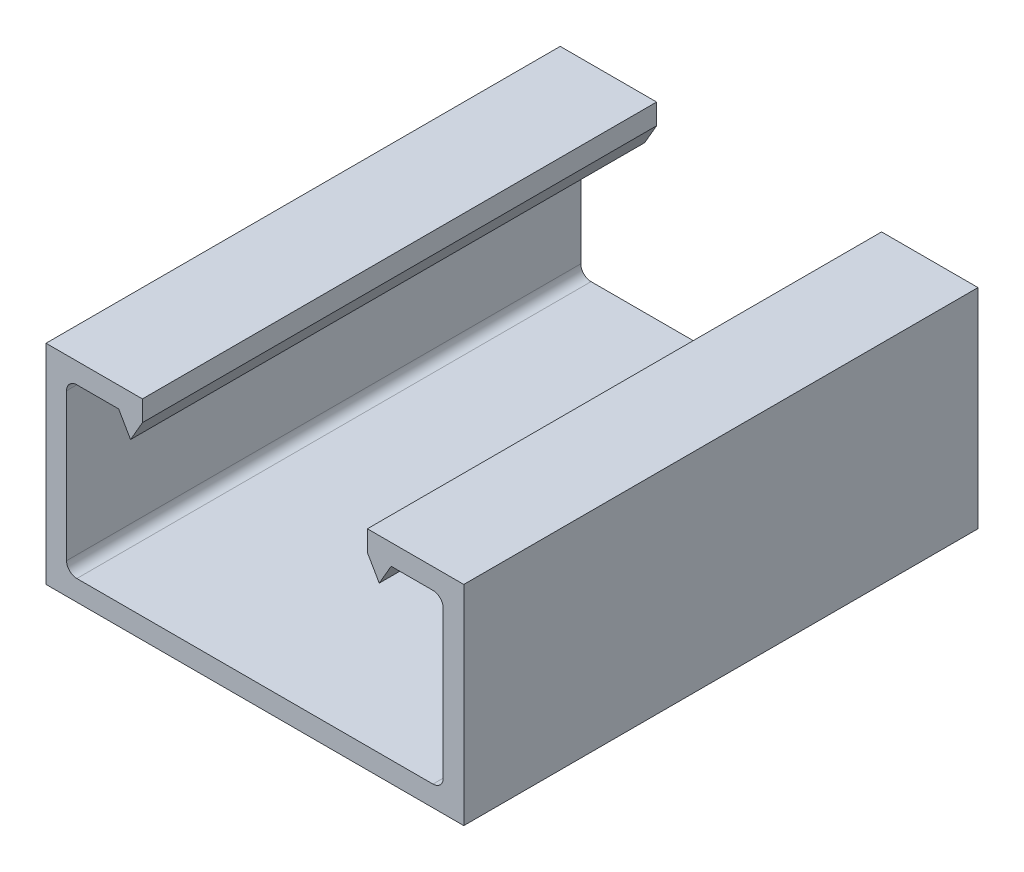
ISO-10303-21;
HEADER;
FILE_DESCRIPTION(('STEP AP214'),'2;1');
FILE_NAME('part.step','',(''),(''),'','','');
FILE_SCHEMA(('AUTOMOTIVE_DESIGN { 1 0 10303 214 1 1 1 1 }'));
ENDSEC;
DATA;
#1=APPLICATION_CONTEXT('core data for automotive mechanical design processes');
#2=APPLICATION_PROTOCOL_DEFINITION('international standard','automotive_design',2000,#1);
#3=PRODUCT_CONTEXT('',#1,'mechanical');
#4=PRODUCT('Part','Part','',(#3));
#5=PRODUCT_RELATED_PRODUCT_CATEGORY('part','',(#4));
#6=PRODUCT_DEFINITION_FORMATION('','',#4);
#7=PRODUCT_DEFINITION_CONTEXT('part definition',#1,'design');
#8=PRODUCT_DEFINITION('design','',#6,#7);
#9=PRODUCT_DEFINITION_SHAPE('','',#8);
#10=(LENGTH_UNIT() NAMED_UNIT(*) SI_UNIT(.MILLI.,.METRE.));
#11=(NAMED_UNIT(*) PLANE_ANGLE_UNIT() SI_UNIT($,.RADIAN.));
#12=(NAMED_UNIT(*) SI_UNIT($,.STERADIAN.) SOLID_ANGLE_UNIT());
#13=UNCERTAINTY_MEASURE_WITH_UNIT(LENGTH_MEASURE(1.E-05),#10,'distance_accuracy_value','');
#14=(GEOMETRIC_REPRESENTATION_CONTEXT(3) GLOBAL_UNCERTAINTY_ASSIGNED_CONTEXT((#13)) GLOBAL_UNIT_ASSIGNED_CONTEXT((#10,
#11,#12)) REPRESENTATION_CONTEXT('',''));
#15=CARTESIAN_POINT('',(0.,0.,0.));
#16=DIRECTION('',(0.,0.,1.));
#17=DIRECTION('',(1.,0.,0.));
#18=AXIS2_PLACEMENT_3D('',#15,#16,#17);
#19=CARTESIAN_POINT('',(-8.79475,-3.635375,12.7));
#20=DIRECTION('',(0.,0.,-1.));
#21=DIRECTION('',(-1.,0.,0.));
#22=AXIS2_PLACEMENT_3D('',#19,#20,#21);
#23=CYLINDRICAL_SURFACE('',#22,0.508);
#24=CARTESIAN_POINT('',(-8.79475,-3.635375,-12.7));
#25=DIRECTION('',(0.,0.,-1.));
#26=DIRECTION('',(1.,0.,0.));
#27=AXIS2_PLACEMENT_3D('',#24,#25,#26);
#28=CIRCLE('',#27,0.508);
#29=CARTESIAN_POINT('',(-8.79475,-4.143375,-12.7));
#30=VERTEX_POINT('',#29);
#31=CARTESIAN_POINT('',(-9.30275,-3.635375,-12.7));
#32=VERTEX_POINT('',#31);
#33=EDGE_CURVE('E200',#30,#32,#28,.T.);
#34=ORIENTED_EDGE('',*,*,#33,.T.);
#35=DIRECTION('',(0.,0.,-1.));
#36=VECTOR('',#35,1.);
#37=CARTESIAN_POINT('',(-9.30275,-3.635375,12.7));
#38=LINE('',#37,#36);
#39=CARTESIAN_POINT('',(-9.30275,-3.635375,12.7));
#40=VERTEX_POINT('',#39);
#41=EDGE_CURVE('E11',#40,#32,#38,.T.);
#42=ORIENTED_EDGE('',*,*,#41,.F.);
#43=CARTESIAN_POINT('',(-8.79475,-3.635375,12.7));
#44=DIRECTION('',(0.,0.,-1.));
#45=DIRECTION('',(1.,0.,0.));
#46=AXIS2_PLACEMENT_3D('',#43,#44,#45);
#47=CIRCLE('',#46,0.508);
#48=CARTESIAN_POINT('',(-8.79475,-4.143375,12.7));
#49=VERTEX_POINT('',#48);
#50=EDGE_CURVE('E238',#49,#40,#47,.T.);
#51=ORIENTED_EDGE('',*,*,#50,.F.);
#52=DIRECTION('',(0.,0.,-1.));
#53=VECTOR('',#52,1.);
#54=CARTESIAN_POINT('',(-8.79475,-4.143375,12.7));
#55=LINE('',#54,#53);
#56=EDGE_CURVE('E196',#49,#30,#55,.T.);
#57=ORIENTED_EDGE('',*,*,#56,.T.);
#58=EDGE_LOOP('',(#34,#42,#51,#57));
#59=FACE_BOUND('',#58,.T.);
#60=ADVANCED_FACE('F32',(#59),#23,.F.);
#61=CARTESIAN_POINT('',(-9.30275,3.635375,12.7));
#62=DIRECTION('',(-1.,0.,0.));
#63=DIRECTION('',(0.,-1.,0.));
#64=AXIS2_PLACEMENT_3D('',#61,#62,#63);
#65=PLANE('',#64);
#66=DIRECTION('',(0.,1.,0.));
#67=VECTOR('',#66,1.);
#68=CARTESIAN_POINT('',(-9.30275,3.635375,-12.7));
#69=LINE('',#68,#67);
#70=CARTESIAN_POINT('',(-9.30275,3.635375,-12.7));
#71=VERTEX_POINT('',#70);
#72=EDGE_CURVE('E203',#32,#71,#69,.T.);
#73=ORIENTED_EDGE('',*,*,#72,.T.);
#74=DIRECTION('',(0.,0.,-1.));
#75=VECTOR('',#74,1.);
#76=CARTESIAN_POINT('',(-9.30275,3.635375,12.7));
#77=LINE('',#76,#75);
#78=CARTESIAN_POINT('',(-9.30275,3.635375,12.7));
#79=VERTEX_POINT('',#78);
#80=EDGE_CURVE('E40',#79,#71,#77,.T.);
#81=ORIENTED_EDGE('',*,*,#80,.F.);
#82=DIRECTION('',(0.,1.,0.));
#83=VECTOR('',#82,1.);
#84=CARTESIAN_POINT('',(-9.30275,3.635375,12.7));
#85=LINE('',#84,#83);
#86=EDGE_CURVE('E127',#40,#79,#85,.T.);
#87=ORIENTED_EDGE('',*,*,#86,.F.);
#88=ORIENTED_EDGE('',*,*,#41,.T.);
#89=EDGE_LOOP('',(#73,#81,#87,#88));
#90=FACE_BOUND('',#89,.T.);
#91=ADVANCED_FACE('F356',(#90),#65,.F.);
#92=CARTESIAN_POINT('',(-8.79475,3.635375,12.7));
#93=DIRECTION('',(0.,0.,-1.));
#94=DIRECTION('',(-1.,0.,0.));
#95=AXIS2_PLACEMENT_3D('',#92,#93,#94);
#96=CYLINDRICAL_SURFACE('',#95,0.508000000000002);
#97=CARTESIAN_POINT('',(-8.79475,3.635375,-12.7));
#98=DIRECTION('',(0.,0.,-1.));
#99=DIRECTION('',(1.,0.,0.));
#100=AXIS2_PLACEMENT_3D('',#97,#98,#99);
#101=CIRCLE('',#100,0.508000000000002);
#102=CARTESIAN_POINT('',(-8.79475,4.143375,-12.7));
#103=VERTEX_POINT('',#102);
#104=EDGE_CURVE('E205',#71,#103,#101,.T.);
#105=ORIENTED_EDGE('',*,*,#104,.T.);
#106=DIRECTION('',(0.,0.,-1.));
#107=VECTOR('',#106,1.);
#108=CARTESIAN_POINT('',(-8.79475,4.143375,12.7));
#109=LINE('',#108,#107);
#110=CARTESIAN_POINT('',(-8.79475,4.143375,12.7));
#111=VERTEX_POINT('',#110);
#112=EDGE_CURVE('E281',#111,#103,#109,.T.);
#113=ORIENTED_EDGE('',*,*,#112,.F.);
#114=CARTESIAN_POINT('',(-8.79475,3.635375,12.7));
#115=DIRECTION('',(0.,0.,-1.));
#116=DIRECTION('',(1.,0.,0.));
#117=AXIS2_PLACEMENT_3D('',#114,#115,#116);
#118=CIRCLE('',#117,0.508000000000002);
#119=EDGE_CURVE('E289',#79,#111,#118,.T.);
#120=ORIENTED_EDGE('',*,*,#119,.F.);
#121=ORIENTED_EDGE('',*,*,#80,.T.);
#122=EDGE_LOOP('',(#105,#113,#120,#121));
#123=FACE_BOUND('',#122,.T.);
#124=ADVANCED_FACE('F287',(#123),#96,.F.);
#125=CARTESIAN_POINT('',(-6.72942574699331,4.143375,12.7));
#126=DIRECTION('',(0.,1.,0.));
#127=DIRECTION('',(0.,0.,1.));
#128=AXIS2_PLACEMENT_3D('',#125,#126,#127);
#129=PLANE('',#128);
#130=DIRECTION('',(1.,0.,0.));
#131=VECTOR('',#130,1.);
#132=CARTESIAN_POINT('',(-6.72942574699331,4.143375,-12.7));
#133=LINE('',#132,#131);
#134=CARTESIAN_POINT('',(-6.72942574699331,4.143375,-12.7));
#135=VERTEX_POINT('',#134);
#136=EDGE_CURVE('E207',#103,#135,#133,.T.);
#137=ORIENTED_EDGE('',*,*,#136,.T.);
#138=DIRECTION('',(0.,0.,-1.));
#139=VECTOR('',#138,1.);
#140=CARTESIAN_POINT('',(-6.72942574699331,4.143375,12.7));
#141=LINE('',#140,#139);
#142=CARTESIAN_POINT('',(-6.72942574699331,4.143375,12.7));
#143=VERTEX_POINT('',#142);
#144=EDGE_CURVE('E278',#143,#135,#141,.T.);
#145=ORIENTED_EDGE('',*,*,#144,.F.);
#146=DIRECTION('',(1.,0.,0.));
#147=VECTOR('',#146,1.);
#148=CARTESIAN_POINT('',(-6.72942574699331,4.143375,12.7));
#149=LINE('',#148,#147);
#150=EDGE_CURVE('E307',#111,#143,#149,.T.);
#151=ORIENTED_EDGE('',*,*,#150,.F.);
#152=ORIENTED_EDGE('',*,*,#112,.T.);
#153=EDGE_LOOP('',(#137,#145,#151,#152));
#154=FACE_BOUND('',#153,.T.);
#155=ADVANCED_FACE('F298',(#154),#129,.F.);
#156=CARTESIAN_POINT('',(-6.72942574699331,4.143375,12.7));
#157=DIRECTION('',(0.866025404088332,0.499999999473641,0.));
#158=DIRECTION('',(-0.499999999473641,0.866025404088332,0.));
#159=AXIS2_PLACEMENT_3D('',#156,#157,#158);
#160=PLANE('',#159);
#161=DIRECTION('',(0.499999999473641,-0.866025404088332,0.));
#162=VECTOR('',#161,1.);
#163=CARTESIAN_POINT('',(-6.72942574699331,4.143375,-12.7));
#164=LINE('',#163,#162);
#165=CARTESIAN_POINT('',(-6.14283787432,3.127375,-12.7));
#166=VERTEX_POINT('',#165);
#167=EDGE_CURVE('E209',#135,#166,#164,.T.);
#168=ORIENTED_EDGE('',*,*,#167,.T.);
#169=DIRECTION('',(0.,0.,-1.));
#170=VECTOR('',#169,1.);
#171=CARTESIAN_POINT('',(-6.14283787432,3.127375,12.7));
#172=LINE('',#171,#170);
#173=CARTESIAN_POINT('',(-6.14283787432,3.127375,12.7));
#174=VERTEX_POINT('',#173);
#175=EDGE_CURVE('E275',#174,#166,#172,.T.);
#176=ORIENTED_EDGE('',*,*,#175,.F.);
#177=DIRECTION('',(0.499999999473641,-0.866025404088332,0.));
#178=VECTOR('',#177,1.);
#179=CARTESIAN_POINT('',(-6.72942574699331,4.143375,12.7));
#180=LINE('',#179,#178);
#181=EDGE_CURVE('E304',#143,#174,#180,.T.);
#182=ORIENTED_EDGE('',*,*,#181,.F.);
#183=ORIENTED_EDGE('',*,*,#144,.T.);
#184=EDGE_LOOP('',(#168,#176,#182,#183));
#185=FACE_BOUND('',#184,.T.);
#186=ADVANCED_FACE('F302',(#185),#160,.F.);
#187=CARTESIAN_POINT('',(-6.14283787432,3.127375,12.7));
#188=DIRECTION('',(-0.866025403480547,0.500000000526355,0.));
#189=DIRECTION('',(-0.500000000526355,-0.866025403480548,0.));
#190=AXIS2_PLACEMENT_3D('',#187,#188,#189);
#191=PLANE('',#190);
#192=DIRECTION('',(0.500000000526355,0.866025403480547,0.));
#193=VECTOR('',#192,1.);
#194=CARTESIAN_POINT('',(-6.14283787432,3.127375,-12.7));
#195=LINE('',#194,#193);
#196=CARTESIAN_POINT('',(-5.55625,4.143375,-12.7));
#197=VERTEX_POINT('',#196);
#198=EDGE_CURVE('E211',#166,#197,#195,.T.);
#199=ORIENTED_EDGE('',*,*,#198,.T.);
#200=DIRECTION('',(0.,0.,-1.));
#201=VECTOR('',#200,1.);
#202=CARTESIAN_POINT('',(-5.55625,4.143375,12.7));
#203=LINE('',#202,#201);
#204=CARTESIAN_POINT('',(-5.55625,4.143375,12.7));
#205=VERTEX_POINT('',#204);
#206=EDGE_CURVE('E272',#205,#197,#203,.T.);
#207=ORIENTED_EDGE('',*,*,#206,.F.);
#208=DIRECTION('',(0.500000000526355,0.866025403480547,0.));
#209=VECTOR('',#208,1.);
#210=CARTESIAN_POINT('',(-6.14283787432,3.127375,12.7));
#211=LINE('',#210,#209);
#212=EDGE_CURVE('E306',#174,#205,#211,.T.);
#213=ORIENTED_EDGE('',*,*,#212,.F.);
#214=ORIENTED_EDGE('',*,*,#175,.T.);
#215=EDGE_LOOP('',(#199,#207,#213,#214));
#216=FACE_BOUND('',#215,.T.);
#217=ADVANCED_FACE('F369',(#216),#191,.F.);
#218=CARTESIAN_POINT('',(-5.55625,4.143375,12.7));
#219=DIRECTION('',(-1.,0.,0.));
#220=DIRECTION('',(0.,0.,1.));
#221=AXIS2_PLACEMENT_3D('',#218,#219,#220);
#222=PLANE('',#221);
#223=DIRECTION('',(0.,1.,0.));
#224=VECTOR('',#223,1.);
#225=CARTESIAN_POINT('',(-5.55625,4.143375,-12.7));
#226=LINE('',#225,#224);
#227=CARTESIAN_POINT('',(-5.55625,5.159375,-12.7));
#228=VERTEX_POINT('',#227);
#229=EDGE_CURVE('E213',#197,#228,#226,.T.);
#230=ORIENTED_EDGE('',*,*,#229,.T.);
#231=DIRECTION('',(0.,0.,-1.));
#232=VECTOR('',#231,1.);
#233=CARTESIAN_POINT('',(-5.55625,5.159375,12.7));
#234=LINE('',#233,#232);
#235=CARTESIAN_POINT('',(-5.55625,5.159375,12.7));
#236=VERTEX_POINT('',#235);
#237=EDGE_CURVE('E269',#236,#228,#234,.T.);
#238=ORIENTED_EDGE('',*,*,#237,.F.);
#239=DIRECTION('',(0.,1.,0.));
#240=VECTOR('',#239,1.);
#241=CARTESIAN_POINT('',(-5.55625,4.143375,12.7));
#242=LINE('',#241,#240);
#243=EDGE_CURVE('E309',#205,#236,#242,.T.);
#244=ORIENTED_EDGE('',*,*,#243,.F.);
#245=ORIENTED_EDGE('',*,*,#206,.T.);
#246=EDGE_LOOP('',(#230,#238,#244,#245));
#247=FACE_BOUND('',#246,.T.);
#248=ADVANCED_FACE('F372',(#247),#222,.F.);
#249=CARTESIAN_POINT('',(-5.55625,5.159375,12.7));
#250=DIRECTION('',(0.,-1.,0.));
#251=DIRECTION('',(1.,0.,0.));
#252=AXIS2_PLACEMENT_3D('',#249,#250,#251);
#253=PLANE('',#252);
#254=DIRECTION('',(-1.,0.,0.));
#255=VECTOR('',#254,1.);
#256=CARTESIAN_POINT('',(-5.55625,5.159375,-12.7));
#257=LINE('',#256,#255);
#258=CARTESIAN_POINT('',(-10.31875,5.159375,-12.7));
#259=VERTEX_POINT('',#258);
#260=EDGE_CURVE('E215',#228,#259,#257,.T.);
#261=ORIENTED_EDGE('',*,*,#260,.T.);
#262=DIRECTION('',(0.,0.,-1.));
#263=VECTOR('',#262,1.);
#264=CARTESIAN_POINT('',(-10.31875,5.159375,12.7));
#265=LINE('',#264,#263);
#266=CARTESIAN_POINT('',(-10.31875,5.159375,12.7));
#267=VERTEX_POINT('',#266);
#268=EDGE_CURVE('E266',#267,#259,#265,.T.);
#269=ORIENTED_EDGE('',*,*,#268,.F.);
#270=DIRECTION('',(-1.,0.,0.));
#271=VECTOR('',#270,1.);
#272=CARTESIAN_POINT('',(-5.55625,5.159375,12.7));
#273=LINE('',#272,#271);
#274=EDGE_CURVE('E315',#236,#267,#273,.T.);
#275=ORIENTED_EDGE('',*,*,#274,.F.);
#276=ORIENTED_EDGE('',*,*,#237,.T.);
#277=EDGE_LOOP('',(#261,#269,#275,#276));
#278=FACE_BOUND('',#277,.T.);
#279=ADVANCED_FACE('F376',(#278),#253,.F.);
#280=CARTESIAN_POINT('',(-10.31875,5.159375,12.7));
#281=DIRECTION('',(1.,0.,0.));
#282=DIRECTION('',(0.,0.,-1.));
#283=AXIS2_PLACEMENT_3D('',#280,#281,#282);
#284=PLANE('',#283);
#285=DIRECTION('',(0.,-1.,0.));
#286=VECTOR('',#285,1.);
#287=CARTESIAN_POINT('',(-10.31875,5.159375,-12.7));
#288=LINE('',#287,#286);
#289=CARTESIAN_POINT('',(-10.31875,-5.159375,-12.7));
#290=VERTEX_POINT('',#289);
#291=EDGE_CURVE('E217',#259,#290,#288,.T.);
#292=ORIENTED_EDGE('',*,*,#291,.T.);
#293=DIRECTION('',(0.,0.,-1.));
#294=VECTOR('',#293,1.);
#295=CARTESIAN_POINT('',(-10.31875,-5.159375,12.7));
#296=LINE('',#295,#294);
#297=CARTESIAN_POINT('',(-10.31875,-5.159375,12.7));
#298=VERTEX_POINT('',#297);
#299=EDGE_CURVE('E263',#298,#290,#296,.T.);
#300=ORIENTED_EDGE('',*,*,#299,.F.);
#301=DIRECTION('',(0.,-1.,0.));
#302=VECTOR('',#301,1.);
#303=CARTESIAN_POINT('',(-10.31875,5.159375,12.7));
#304=LINE('',#303,#302);
#305=EDGE_CURVE('E317',#267,#298,#304,.T.);
#306=ORIENTED_EDGE('',*,*,#305,.F.);
#307=ORIENTED_EDGE('',*,*,#268,.T.);
#308=EDGE_LOOP('',(#292,#300,#306,#307));
#309=FACE_BOUND('',#308,.T.);
#310=ADVANCED_FACE('F380',(#309),#284,.F.);
#311=CARTESIAN_POINT('',(-10.31875,-5.159375,12.7));
#312=DIRECTION('',(0.,1.,0.));
#313=DIRECTION('',(0.,0.,1.));
#314=AXIS2_PLACEMENT_3D('',#311,#312,#313);
#315=PLANE('',#314);
#316=DIRECTION('',(1.,0.,0.));
#317=VECTOR('',#316,1.);
#318=CARTESIAN_POINT('',(-10.31875,-5.159375,-12.7));
#319=LINE('',#318,#317);
#320=CARTESIAN_POINT('',(10.31875,-5.159375,-12.7));
#321=VERTEX_POINT('',#320);
#322=EDGE_CURVE('E219',#290,#321,#319,.T.);
#323=ORIENTED_EDGE('',*,*,#322,.T.);
#324=DIRECTION('',(0.,0.,-1.));
#325=VECTOR('',#324,1.);
#326=CARTESIAN_POINT('',(10.31875,-5.159375,12.7));
#327=LINE('',#326,#325);
#328=CARTESIAN_POINT('',(10.31875,-5.159375,12.7));
#329=VERTEX_POINT('',#328);
#330=EDGE_CURVE('E260',#329,#321,#327,.T.);
#331=ORIENTED_EDGE('',*,*,#330,.F.);
#332=DIRECTION('',(1.,0.,0.));
#333=VECTOR('',#332,1.);
#334=CARTESIAN_POINT('',(-10.31875,-5.159375,12.7));
#335=LINE('',#334,#333);
#336=EDGE_CURVE('E319',#298,#329,#335,.T.);
#337=ORIENTED_EDGE('',*,*,#336,.F.);
#338=ORIENTED_EDGE('',*,*,#299,.T.);
#339=EDGE_LOOP('',(#323,#331,#337,#338));
#340=FACE_BOUND('',#339,.T.);
#341=ADVANCED_FACE('F384',(#340),#315,.F.);
#342=CARTESIAN_POINT('',(10.31875,-5.159375,12.7));
#343=DIRECTION('',(-1.,0.,0.));
#344=DIRECTION('',(0.,-1.,0.));
#345=AXIS2_PLACEMENT_3D('',#342,#343,#344);
#346=PLANE('',#345);
#347=DIRECTION('',(0.,1.,0.));
#348=VECTOR('',#347,1.);
#349=CARTESIAN_POINT('',(10.31875,-5.159375,-12.7));
#350=LINE('',#349,#348);
#351=CARTESIAN_POINT('',(10.31875,5.159375,-12.7));
#352=VERTEX_POINT('',#351);
#353=EDGE_CURVE('E221',#321,#352,#350,.T.);
#354=ORIENTED_EDGE('',*,*,#353,.T.);
#355=DIRECTION('',(0.,0.,-1.));
#356=VECTOR('',#355,1.);
#357=CARTESIAN_POINT('',(10.31875,5.159375,12.7));
#358=LINE('',#357,#356);
#359=CARTESIAN_POINT('',(10.31875,5.159375,12.7));
#360=VERTEX_POINT('',#359);
#361=EDGE_CURVE('E257',#360,#352,#358,.T.);
#362=ORIENTED_EDGE('',*,*,#361,.F.);
#363=DIRECTION('',(0.,1.,0.));
#364=VECTOR('',#363,1.);
#365=CARTESIAN_POINT('',(10.31875,-5.159375,12.7));
#366=LINE('',#365,#364);
#367=EDGE_CURVE('E321',#329,#360,#366,.T.);
#368=ORIENTED_EDGE('',*,*,#367,.F.);
#369=ORIENTED_EDGE('',*,*,#330,.T.);
#370=EDGE_LOOP('',(#354,#362,#368,#369));
#371=FACE_BOUND('',#370,.T.);
#372=ADVANCED_FACE('F388',(#371),#346,.F.);
#373=CARTESIAN_POINT('',(10.31875,5.159375,12.7));
#374=DIRECTION('',(0.,-1.,0.));
#375=DIRECTION('',(1.,0.,0.));
#376=AXIS2_PLACEMENT_3D('',#373,#374,#375);
#377=PLANE('',#376);
#378=DIRECTION('',(-1.,0.,0.));
#379=VECTOR('',#378,1.);
#380=CARTESIAN_POINT('',(10.31875,5.159375,-12.7));
#381=LINE('',#380,#379);
#382=CARTESIAN_POINT('',(5.55625,5.159375,-12.7));
#383=VERTEX_POINT('',#382);
#384=EDGE_CURVE('E223',#352,#383,#381,.T.);
#385=ORIENTED_EDGE('',*,*,#384,.T.);
#386=DIRECTION('',(0.,0.,-1.));
#387=VECTOR('',#386,1.);
#388=CARTESIAN_POINT('',(5.55625,5.159375,12.7));
#389=LINE('',#388,#387);
#390=CARTESIAN_POINT('',(5.55625,5.159375,12.7));
#391=VERTEX_POINT('',#390);
#392=EDGE_CURVE('E254',#391,#383,#389,.T.);
#393=ORIENTED_EDGE('',*,*,#392,.F.);
#394=DIRECTION('',(-1.,0.,0.));
#395=VECTOR('',#394,1.);
#396=CARTESIAN_POINT('',(10.31875,5.159375,12.7));
#397=LINE('',#396,#395);
#398=EDGE_CURVE('E323',#360,#391,#397,.T.);
#399=ORIENTED_EDGE('',*,*,#398,.F.);
#400=ORIENTED_EDGE('',*,*,#361,.T.);
#401=EDGE_LOOP('',(#385,#393,#399,#400));
#402=FACE_BOUND('',#401,.T.);
#403=ADVANCED_FACE('F392',(#402),#377,.F.);
#404=CARTESIAN_POINT('',(5.55625,4.143375,12.7));
#405=DIRECTION('',(1.,0.,0.));
#406=DIRECTION('',(0.,1.,0.));
#407=AXIS2_PLACEMENT_3D('',#404,#405,#406);
#408=PLANE('',#407);
#409=DIRECTION('',(0.,-1.,0.));
#410=VECTOR('',#409,1.);
#411=CARTESIAN_POINT('',(5.55625,4.143375,-12.7));
#412=LINE('',#411,#410);
#413=CARTESIAN_POINT('',(5.55625,4.143375,-12.7));
#414=VERTEX_POINT('',#413);
#415=EDGE_CURVE('E225',#383,#414,#412,.T.);
#416=ORIENTED_EDGE('',*,*,#415,.T.);
#417=DIRECTION('',(0.,0.,-1.));
#418=VECTOR('',#417,1.);
#419=CARTESIAN_POINT('',(5.55625,4.143375,12.7));
#420=LINE('',#419,#418);
#421=CARTESIAN_POINT('',(5.55625,4.143375,12.7));
#422=VERTEX_POINT('',#421);
#423=EDGE_CURVE('E251',#422,#414,#420,.T.);
#424=ORIENTED_EDGE('',*,*,#423,.F.);
#425=DIRECTION('',(0.,-1.,0.));
#426=VECTOR('',#425,1.);
#427=CARTESIAN_POINT('',(5.55625,4.143375,12.7));
#428=LINE('',#427,#426);
#429=EDGE_CURVE('E325',#391,#422,#428,.T.);
#430=ORIENTED_EDGE('',*,*,#429,.F.);
#431=ORIENTED_EDGE('',*,*,#392,.T.);
#432=EDGE_LOOP('',(#416,#424,#430,#431));
#433=FACE_BOUND('',#432,.T.);
#434=ADVANCED_FACE('F396',(#433),#408,.F.);
#435=CARTESIAN_POINT('',(6.14283787432,3.127375,12.7));
#436=DIRECTION('',(0.866025403480547,0.500000000526356,0.));
#437=DIRECTION('',(-0.500000000526356,0.866025403480547,0.));
#438=AXIS2_PLACEMENT_3D('',#435,#436,#437);
#439=PLANE('',#438);
#440=DIRECTION('',(0.500000000526356,-0.866025403480547,0.));
#441=VECTOR('',#440,1.);
#442=CARTESIAN_POINT('',(6.14283787432,3.127375,-12.7));
#443=LINE('',#442,#441);
#444=CARTESIAN_POINT('',(6.14283787432,3.127375,-12.7));
#445=VERTEX_POINT('',#444);
#446=EDGE_CURVE('E227',#414,#445,#443,.T.);
#447=ORIENTED_EDGE('',*,*,#446,.T.);
#448=DIRECTION('',(0.,0.,-1.));
#449=VECTOR('',#448,1.);
#450=CARTESIAN_POINT('',(6.14283787432,3.127375,12.7));
#451=LINE('',#450,#449);
#452=CARTESIAN_POINT('',(6.14283787432,3.127375,12.7));
#453=VERTEX_POINT('',#452);
#454=EDGE_CURVE('E248',#453,#445,#451,.T.);
#455=ORIENTED_EDGE('',*,*,#454,.F.);
#456=DIRECTION('',(0.500000000526356,-0.866025403480547,0.));
#457=VECTOR('',#456,1.);
#458=CARTESIAN_POINT('',(6.14283787432,3.127375,12.7));
#459=LINE('',#458,#457);
#460=EDGE_CURVE('E327',#422,#453,#459,.T.);
#461=ORIENTED_EDGE('',*,*,#460,.F.);
#462=ORIENTED_EDGE('',*,*,#423,.T.);
#463=EDGE_LOOP('',(#447,#455,#461,#462));
#464=FACE_BOUND('',#463,.T.);
#465=ADVANCED_FACE('F400',(#464),#439,.F.);
#466=CARTESIAN_POINT('',(6.72942574699331,4.143375,12.7));
#467=DIRECTION('',(-0.866025404088332,0.499999999473641,0.));
#468=DIRECTION('',(-0.499999999473641,-0.866025404088332,0.));
#469=AXIS2_PLACEMENT_3D('',#466,#467,#468);
#470=PLANE('',#469);
#471=DIRECTION('',(0.499999999473641,0.866025404088332,0.));
#472=VECTOR('',#471,1.);
#473=CARTESIAN_POINT('',(6.72942574699331,4.143375,-12.7));
#474=LINE('',#473,#472);
#475=CARTESIAN_POINT('',(6.72942574699331,4.143375,-12.7));
#476=VERTEX_POINT('',#475);
#477=EDGE_CURVE('E229',#445,#476,#474,.T.);
#478=ORIENTED_EDGE('',*,*,#477,.T.);
#479=DIRECTION('',(0.,0.,-1.));
#480=VECTOR('',#479,1.);
#481=CARTESIAN_POINT('',(6.72942574699331,4.143375,12.7));
#482=LINE('',#481,#480);
#483=CARTESIAN_POINT('',(6.72942574699331,4.143375,12.7));
#484=VERTEX_POINT('',#483);
#485=EDGE_CURVE('E245',#484,#476,#482,.T.);
#486=ORIENTED_EDGE('',*,*,#485,.F.);
#487=DIRECTION('',(0.499999999473641,0.866025404088332,0.));
#488=VECTOR('',#487,1.);
#489=CARTESIAN_POINT('',(6.72942574699331,4.143375,12.7));
#490=LINE('',#489,#488);
#491=EDGE_CURVE('E329',#453,#484,#490,.T.);
#492=ORIENTED_EDGE('',*,*,#491,.F.);
#493=ORIENTED_EDGE('',*,*,#454,.T.);
#494=EDGE_LOOP('',(#478,#486,#492,#493));
#495=FACE_BOUND('',#494,.T.);
#496=ADVANCED_FACE('F404',(#495),#470,.F.);
#497=CARTESIAN_POINT('',(8.79475,4.143375,12.7));
#498=DIRECTION('',(0.,1.,0.));
#499=DIRECTION('',(0.,0.,1.));
#500=AXIS2_PLACEMENT_3D('',#497,#498,#499);
#501=PLANE('',#500);
#502=DIRECTION('',(1.,0.,0.));
#503=VECTOR('',#502,1.);
#504=CARTESIAN_POINT('',(8.79475,4.143375,-12.7));
#505=LINE('',#504,#503);
#506=CARTESIAN_POINT('',(8.79475,4.143375,-12.7));
#507=VERTEX_POINT('',#506);
#508=EDGE_CURVE('E231',#476,#507,#505,.T.);
#509=ORIENTED_EDGE('',*,*,#508,.T.);
#510=DIRECTION('',(0.,0.,-1.));
#511=VECTOR('',#510,1.);
#512=CARTESIAN_POINT('',(8.79475,4.143375,12.7));
#513=LINE('',#512,#511);
#514=CARTESIAN_POINT('',(8.79475,4.143375,12.7));
#515=VERTEX_POINT('',#514);
#516=EDGE_CURVE('E242',#515,#507,#513,.T.);
#517=ORIENTED_EDGE('',*,*,#516,.F.);
#518=DIRECTION('',(1.,0.,0.));
#519=VECTOR('',#518,1.);
#520=CARTESIAN_POINT('',(8.79475,4.143375,12.7));
#521=LINE('',#520,#519);
#522=EDGE_CURVE('E331',#484,#515,#521,.T.);
#523=ORIENTED_EDGE('',*,*,#522,.F.);
#524=ORIENTED_EDGE('',*,*,#485,.T.);
#525=EDGE_LOOP('',(#509,#517,#523,#524));
#526=FACE_BOUND('',#525,.T.);
#527=ADVANCED_FACE('F337',(#526),#501,.F.);
#528=CARTESIAN_POINT('',(8.79475,3.635375,12.7));
#529=DIRECTION('',(0.,0.,-1.));
#530=DIRECTION('',(-1.,0.,0.));
#531=AXIS2_PLACEMENT_3D('',#528,#529,#530);
#532=CYLINDRICAL_SURFACE('',#531,0.508);
#533=CARTESIAN_POINT('',(8.79475,3.635375,-12.7));
#534=DIRECTION('',(0.,0.,-1.));
#535=DIRECTION('',(1.,0.,0.));
#536=AXIS2_PLACEMENT_3D('',#533,#534,#535);
#537=CIRCLE('',#536,0.508);
#538=CARTESIAN_POINT('',(9.30275,3.635375,-12.7));
#539=VERTEX_POINT('',#538);
#540=EDGE_CURVE('E233',#507,#539,#537,.T.);
#541=ORIENTED_EDGE('',*,*,#540,.T.);
#542=DIRECTION('',(0.,0.,-1.));
#543=VECTOR('',#542,1.);
#544=CARTESIAN_POINT('',(9.30275,3.635375,12.7));
#545=LINE('',#544,#543);
#546=CARTESIAN_POINT('',(9.30275,3.635375,12.7));
#547=VERTEX_POINT('',#546);
#548=EDGE_CURVE('E191',#547,#539,#545,.T.);
#549=ORIENTED_EDGE('',*,*,#548,.F.);
#550=CARTESIAN_POINT('',(8.79475,3.635375,12.7));
#551=DIRECTION('',(0.,0.,-1.));
#552=DIRECTION('',(1.,0.,0.));
#553=AXIS2_PLACEMENT_3D('',#550,#551,#552);
#554=CIRCLE('',#553,0.508);
#555=EDGE_CURVE('E182',#515,#547,#554,.T.);
#556=ORIENTED_EDGE('',*,*,#555,.F.);
#557=ORIENTED_EDGE('',*,*,#516,.T.);
#558=EDGE_LOOP('',(#541,#549,#556,#557));
#559=FACE_BOUND('',#558,.T.);
#560=ADVANCED_FACE('F341',(#559),#532,.F.);
#561=CARTESIAN_POINT('',(9.30275,-3.635375,12.7));
#562=DIRECTION('',(1.,0.,0.));
#563=DIRECTION('',(0.,1.,0.));
#564=AXIS2_PLACEMENT_3D('',#561,#562,#563);
#565=PLANE('',#564);
#566=DIRECTION('',(0.,-1.,0.));
#567=VECTOR('',#566,1.);
#568=CARTESIAN_POINT('',(9.30275,-3.635375,-12.7));
#569=LINE('',#568,#567);
#570=CARTESIAN_POINT('',(9.30275,-3.635375,-12.7));
#571=VERTEX_POINT('',#570);
#572=EDGE_CURVE('E190',#539,#571,#569,.T.);
#573=ORIENTED_EDGE('',*,*,#572,.T.);
#574=DIRECTION('',(0.,0.,-1.));
#575=VECTOR('',#574,1.);
#576=CARTESIAN_POINT('',(9.30275,-3.635375,12.7));
#577=LINE('',#576,#575);
#578=CARTESIAN_POINT('',(9.30275,-3.635375,12.7));
#579=VERTEX_POINT('',#578);
#580=EDGE_CURVE('E187',#579,#571,#577,.T.);
#581=ORIENTED_EDGE('',*,*,#580,.F.);
#582=DIRECTION('',(0.,-1.,0.));
#583=VECTOR('',#582,1.);
#584=CARTESIAN_POINT('',(9.30275,-3.635375,12.7));
#585=LINE('',#584,#583);
#586=EDGE_CURVE('E176',#547,#579,#585,.T.);
#587=ORIENTED_EDGE('',*,*,#586,.F.);
#588=ORIENTED_EDGE('',*,*,#548,.T.);
#589=EDGE_LOOP('',(#573,#581,#587,#588));
#590=FACE_BOUND('',#589,.T.);
#591=ADVANCED_FACE('F188',(#590),#565,.F.);
#592=CARTESIAN_POINT('',(8.79475,-3.635375,12.7));
#593=DIRECTION('',(0.,0.,-1.));
#594=DIRECTION('',(-1.,0.,0.));
#595=AXIS2_PLACEMENT_3D('',#592,#593,#594);
#596=CYLINDRICAL_SURFACE('',#595,0.508000000000001);
#597=CARTESIAN_POINT('',(8.79475,-3.635375,-12.7));
#598=DIRECTION('',(0.,0.,-1.));
#599=DIRECTION('',(1.,0.,0.));
#600=AXIS2_PLACEMENT_3D('',#597,#598,#599);
#601=CIRCLE('',#600,0.508000000000001);
#602=CARTESIAN_POINT('',(8.79475,-4.143375,-12.7));
#603=VERTEX_POINT('',#602);
#604=EDGE_CURVE('E113',#571,#603,#601,.T.);
#605=ORIENTED_EDGE('',*,*,#604,.T.);
#606=DIRECTION('',(0.,0.,-1.));
#607=VECTOR('',#606,1.);
#608=CARTESIAN_POINT('',(8.79475,-4.143375,12.7));
#609=LINE('',#608,#607);
#610=CARTESIAN_POINT('',(8.79475,-4.143375,12.7));
#611=VERTEX_POINT('',#610);
#612=EDGE_CURVE('E192',#611,#603,#609,.T.);
#613=ORIENTED_EDGE('',*,*,#612,.F.);
#614=CARTESIAN_POINT('',(8.79475,-3.635375,12.7));
#615=DIRECTION('',(0.,0.,-1.));
#616=DIRECTION('',(1.,0.,0.));
#617=AXIS2_PLACEMENT_3D('',#614,#615,#616);
#618=CIRCLE('',#617,0.508000000000001);
#619=EDGE_CURVE('E180',#579,#611,#618,.T.);
#620=ORIENTED_EDGE('',*,*,#619,.F.);
#621=ORIENTED_EDGE('',*,*,#580,.T.);
#622=EDGE_LOOP('',(#605,#613,#620,#621));
#623=FACE_BOUND('',#622,.T.);
#624=ADVANCED_FACE('F194',(#623),#596,.F.);
#625=CARTESIAN_POINT('',(-8.79475,-4.143375,12.7));
#626=DIRECTION('',(0.,-1.,0.));
#627=DIRECTION('',(1.,0.,0.));
#628=AXIS2_PLACEMENT_3D('',#625,#626,#627);
#629=PLANE('',#628);
#630=DIRECTION('',(-1.,0.,0.));
#631=VECTOR('',#630,1.);
#632=CARTESIAN_POINT('',(-8.79475,-4.143375,-12.7));
#633=LINE('',#632,#631);
#634=EDGE_CURVE('E119',#603,#30,#633,.T.);
#635=ORIENTED_EDGE('',*,*,#634,.T.);
#636=ORIENTED_EDGE('',*,*,#56,.F.);
#637=DIRECTION('',(-1.,0.,0.));
#638=VECTOR('',#637,1.);
#639=CARTESIAN_POINT('',(-8.79475,-4.143375,12.7));
#640=LINE('',#639,#638);
#641=EDGE_CURVE('E48',#611,#49,#640,.T.);
#642=ORIENTED_EDGE('',*,*,#641,.F.);
#643=ORIENTED_EDGE('',*,*,#612,.T.);
#644=EDGE_LOOP('',(#635,#636,#642,#643));
#645=FACE_BOUND('',#644,.T.);
#646=ADVANCED_FACE('F345',(#645),#629,.F.);
#647=CARTESIAN_POINT('',(-8.79475,-3.635375,12.7));
#648=DIRECTION('',(0.,0.,1.));
#649=DIRECTION('',(1.,0.,0.));
#650=AXIS2_PLACEMENT_3D('',#647,#648,#649);
#651=PLANE('',#650);
#652=ORIENTED_EDGE('',*,*,#50,.T.);
#653=ORIENTED_EDGE('',*,*,#86,.T.);
#654=ORIENTED_EDGE('',*,*,#119,.T.);
#655=ORIENTED_EDGE('',*,*,#150,.T.);
#656=ORIENTED_EDGE('',*,*,#181,.T.);
#657=ORIENTED_EDGE('',*,*,#212,.T.);
#658=ORIENTED_EDGE('',*,*,#243,.T.);
#659=ORIENTED_EDGE('',*,*,#274,.T.);
#660=ORIENTED_EDGE('',*,*,#305,.T.);
#661=ORIENTED_EDGE('',*,*,#336,.T.);
#662=ORIENTED_EDGE('',*,*,#367,.T.);
#663=ORIENTED_EDGE('',*,*,#398,.T.);
#664=ORIENTED_EDGE('',*,*,#429,.T.);
#665=ORIENTED_EDGE('',*,*,#460,.T.);
#666=ORIENTED_EDGE('',*,*,#491,.T.);
#667=ORIENTED_EDGE('',*,*,#522,.T.);
#668=ORIENTED_EDGE('',*,*,#555,.T.);
#669=ORIENTED_EDGE('',*,*,#586,.T.);
#670=ORIENTED_EDGE('',*,*,#619,.T.);
#671=ORIENTED_EDGE('',*,*,#641,.T.);
#672=EDGE_LOOP('',(#652,#653,#654,#655,#656,#657,#658,#659,#660,#661,#662,#663,#664,#665,#666,
#667,#668,#669,#670,#671));
#673=FACE_BOUND('',#672,.T.);
#674=ADVANCED_FACE('F178',(#673),#651,.T.);
#675=CARTESIAN_POINT('',(-8.79475,-3.635375,-12.7));
#676=DIRECTION('',(0.,0.,1.));
#677=DIRECTION('',(1.,0.,0.));
#678=AXIS2_PLACEMENT_3D('',#675,#676,#677);
#679=PLANE('',#678);
#680=ORIENTED_EDGE('',*,*,#33,.F.);
#681=ORIENTED_EDGE('',*,*,#634,.F.);
#682=ORIENTED_EDGE('',*,*,#604,.F.);
#683=ORIENTED_EDGE('',*,*,#572,.F.);
#684=ORIENTED_EDGE('',*,*,#540,.F.);
#685=ORIENTED_EDGE('',*,*,#508,.F.);
#686=ORIENTED_EDGE('',*,*,#477,.F.);
#687=ORIENTED_EDGE('',*,*,#446,.F.);
#688=ORIENTED_EDGE('',*,*,#415,.F.);
#689=ORIENTED_EDGE('',*,*,#384,.F.);
#690=ORIENTED_EDGE('',*,*,#353,.F.);
#691=ORIENTED_EDGE('',*,*,#322,.F.);
#692=ORIENTED_EDGE('',*,*,#291,.F.);
#693=ORIENTED_EDGE('',*,*,#260,.F.);
#694=ORIENTED_EDGE('',*,*,#229,.F.);
#695=ORIENTED_EDGE('',*,*,#198,.F.);
#696=ORIENTED_EDGE('',*,*,#167,.F.);
#697=ORIENTED_EDGE('',*,*,#136,.F.);
#698=ORIENTED_EDGE('',*,*,#104,.F.);
#699=ORIENTED_EDGE('',*,*,#72,.F.);
#700=EDGE_LOOP('',(#680,#681,#682,#683,#684,#685,#686,#687,#688,#689,#690,#691,#692,#693,#694,
#695,#696,#697,#698,#699));
#701=FACE_BOUND('',#700,.T.);
#702=ADVANCED_FACE('F293',(#701),#679,.F.);
#703=CLOSED_SHELL('',(#60,#91,#124,#155,#186,#217,#248,#279,#310,#341,#372,#403,#434,#465,#496,
#527,#560,#591,#624,#646,#674,#702));
#704=MANIFOLD_SOLID_BREP('B2',#703);
#705=ADVANCED_BREP_SHAPE_REPRESENTATION('',(#18,#704),#14);
#706=SHAPE_DEFINITION_REPRESENTATION(#9,#705);
ENDSEC;
END-ISO-10303-21;
